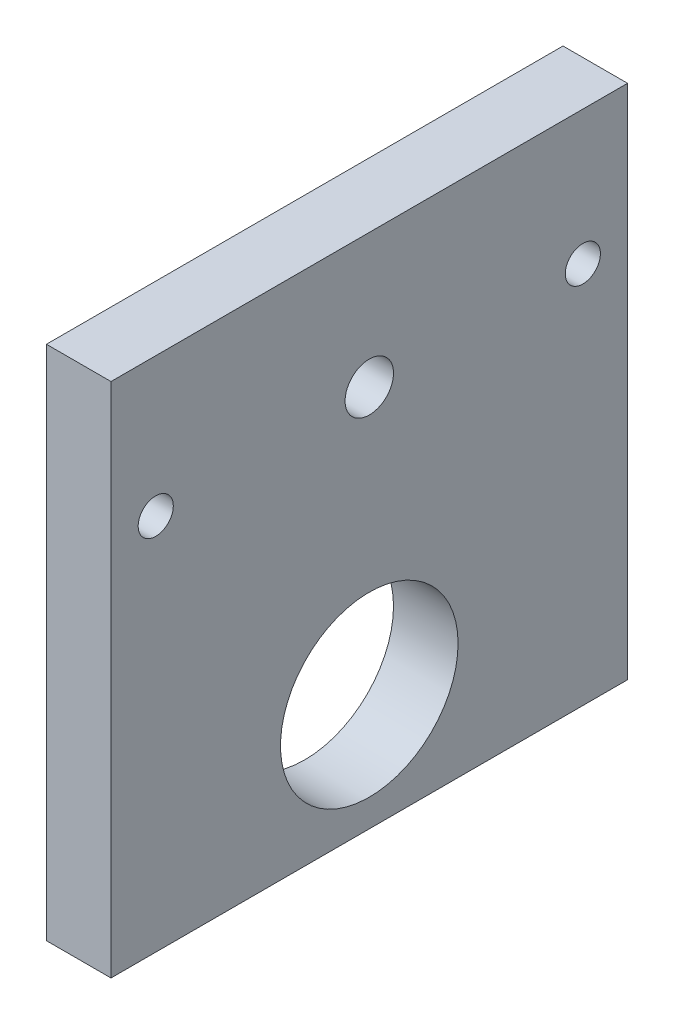
ISO-10303-21;
HEADER;
FILE_DESCRIPTION(('STEP AP214'),'2;1');
FILE_NAME('part.step','',(''),(''),'','','');
FILE_SCHEMA(('AUTOMOTIVE_DESIGN { 1 0 10303 214 1 1 1 1 }'));
ENDSEC;
DATA;
#1=APPLICATION_CONTEXT('core data for automotive mechanical design processes');
#2=APPLICATION_PROTOCOL_DEFINITION('international standard','automotive_design',2000,#1);
#3=PRODUCT_CONTEXT('',#1,'mechanical');
#4=PRODUCT('Part','Part','',(#3));
#5=PRODUCT_RELATED_PRODUCT_CATEGORY('part','',(#4));
#6=PRODUCT_DEFINITION_FORMATION('','',#4);
#7=PRODUCT_DEFINITION_CONTEXT('part definition',#1,'design');
#8=PRODUCT_DEFINITION('design','',#6,#7);
#9=PRODUCT_DEFINITION_SHAPE('','',#8);
#10=(LENGTH_UNIT() NAMED_UNIT(*) SI_UNIT(.MILLI.,.METRE.));
#11=(NAMED_UNIT(*) PLANE_ANGLE_UNIT() SI_UNIT($,.RADIAN.));
#12=(NAMED_UNIT(*) SI_UNIT($,.STERADIAN.) SOLID_ANGLE_UNIT());
#13=UNCERTAINTY_MEASURE_WITH_UNIT(LENGTH_MEASURE(1.E-05),#10,'distance_accuracy_value','');
#14=(GEOMETRIC_REPRESENTATION_CONTEXT(3) GLOBAL_UNCERTAINTY_ASSIGNED_CONTEXT((#13)) GLOBAL_UNIT_ASSIGNED_CONTEXT((#10,
#11,#12)) REPRESENTATION_CONTEXT('',''));
#15=CARTESIAN_POINT('',(0.,0.,0.));
#16=DIRECTION('',(0.,0.,1.));
#17=DIRECTION('',(1.,0.,0.));
#18=AXIS2_PLACEMENT_3D('',#15,#16,#17);
#19=CARTESIAN_POINT('',(6.35,-25.4,-25.4));
#20=DIRECTION('',(0.,0.,1.));
#21=DIRECTION('',(1.,0.,0.));
#22=AXIS2_PLACEMENT_3D('',#19,#20,#21);
#23=PLANE('',#22);
#24=DIRECTION('',(0.,1.,0.));
#25=VECTOR('',#24,1.);
#26=CARTESIAN_POINT('',(0.,-25.4,-25.4));
#27=LINE('',#26,#25);
#28=CARTESIAN_POINT('',(0.,-25.4,-25.4));
#29=VERTEX_POINT('',#28);
#30=CARTESIAN_POINT('',(0.,25.4,-25.4));
#31=VERTEX_POINT('',#30);
#32=EDGE_CURVE('E100',#29,#31,#27,.T.);
#33=ORIENTED_EDGE('',*,*,#32,.T.);
#34=DIRECTION('',(-1.,0.,0.));
#35=VECTOR('',#34,1.);
#36=CARTESIAN_POINT('',(6.35,25.4,-25.4));
#37=LINE('',#36,#35);
#38=CARTESIAN_POINT('',(6.35,25.4,-25.4));
#39=VERTEX_POINT('',#38);
#40=EDGE_CURVE('E11',#39,#31,#37,.T.);
#41=ORIENTED_EDGE('',*,*,#40,.F.);
#42=DIRECTION('',(0.,1.,0.));
#43=VECTOR('',#42,1.);
#44=CARTESIAN_POINT('',(6.35,-25.4,-25.4));
#45=LINE('',#44,#43);
#46=CARTESIAN_POINT('',(6.35,-25.4,-25.4));
#47=VERTEX_POINT('',#46);
#48=EDGE_CURVE('E87',#47,#39,#45,.T.);
#49=ORIENTED_EDGE('',*,*,#48,.F.);
#50=DIRECTION('',(-1.,0.,0.));
#51=VECTOR('',#50,1.);
#52=CARTESIAN_POINT('',(6.35,-25.4,-25.4));
#53=LINE('',#52,#51);
#54=EDGE_CURVE('E96',#47,#29,#53,.T.);
#55=ORIENTED_EDGE('',*,*,#54,.T.);
#56=EDGE_LOOP('',(#33,#41,#49,#55));
#57=FACE_BOUND('',#56,.T.);
#58=ADVANCED_FACE('F35',(#57),#23,.F.);
#59=CARTESIAN_POINT('',(6.35,25.4,25.4));
#60=DIRECTION('',(0.,-1.,0.));
#61=DIRECTION('',(0.,0.,-1.));
#62=AXIS2_PLACEMENT_3D('',#59,#60,#61);
#63=PLANE('',#62);
#64=DIRECTION('',(0.,0.,1.));
#65=VECTOR('',#64,1.);
#66=CARTESIAN_POINT('',(0.,25.4,25.4));
#67=LINE('',#66,#65);
#68=CARTESIAN_POINT('',(0.,25.4,25.4));
#69=VERTEX_POINT('',#68);
#70=EDGE_CURVE('E91',#31,#69,#67,.T.);
#71=ORIENTED_EDGE('',*,*,#70,.T.);
#72=DIRECTION('',(-1.,0.,0.));
#73=VECTOR('',#72,1.);
#74=CARTESIAN_POINT('',(6.35,25.4,25.4));
#75=LINE('',#74,#73);
#76=CARTESIAN_POINT('',(6.35,25.4,25.4));
#77=VERTEX_POINT('',#76);
#78=EDGE_CURVE('E44',#77,#69,#75,.T.);
#79=ORIENTED_EDGE('',*,*,#78,.F.);
#80=DIRECTION('',(0.,0.,1.));
#81=VECTOR('',#80,1.);
#82=CARTESIAN_POINT('',(6.35,25.4,25.4));
#83=LINE('',#82,#81);
#84=EDGE_CURVE('E82',#39,#77,#83,.T.);
#85=ORIENTED_EDGE('',*,*,#84,.F.);
#86=ORIENTED_EDGE('',*,*,#40,.T.);
#87=EDGE_LOOP('',(#71,#79,#85,#86));
#88=FACE_BOUND('',#87,.T.);
#89=ADVANCED_FACE('F90',(#88),#63,.F.);
#90=CARTESIAN_POINT('',(6.35,-25.4,25.4));
#91=DIRECTION('',(0.,0.,-1.));
#92=DIRECTION('',(-1.,0.,0.));
#93=AXIS2_PLACEMENT_3D('',#90,#91,#92);
#94=PLANE('',#93);
#95=DIRECTION('',(0.,-1.,0.));
#96=VECTOR('',#95,1.);
#97=CARTESIAN_POINT('',(0.,-25.4,25.4));
#98=LINE('',#97,#96);
#99=CARTESIAN_POINT('',(0.,-25.4,25.4));
#100=VERTEX_POINT('',#99);
#101=EDGE_CURVE('E69',#69,#100,#98,.T.);
#102=ORIENTED_EDGE('',*,*,#101,.T.);
#103=DIRECTION('',(-1.,0.,0.));
#104=VECTOR('',#103,1.);
#105=CARTESIAN_POINT('',(6.35,-25.4,25.4));
#106=LINE('',#105,#104);
#107=CARTESIAN_POINT('',(6.35,-25.4,25.4));
#108=VERTEX_POINT('',#107);
#109=EDGE_CURVE('E92',#108,#100,#106,.T.);
#110=ORIENTED_EDGE('',*,*,#109,.F.);
#111=DIRECTION('',(0.,-1.,0.));
#112=VECTOR('',#111,1.);
#113=CARTESIAN_POINT('',(6.35,-25.4,25.4));
#114=LINE('',#113,#112);
#115=EDGE_CURVE('E85',#77,#108,#114,.T.);
#116=ORIENTED_EDGE('',*,*,#115,.F.);
#117=ORIENTED_EDGE('',*,*,#78,.T.);
#118=EDGE_LOOP('',(#102,#110,#116,#117));
#119=FACE_BOUND('',#118,.T.);
#120=ADVANCED_FACE('F94',(#119),#94,.F.);
#121=CARTESIAN_POINT('',(6.35,-25.4,25.4));
#122=DIRECTION('',(0.,1.,0.));
#123=DIRECTION('',(0.,0.,1.));
#124=AXIS2_PLACEMENT_3D('',#121,#122,#123);
#125=PLANE('',#124);
#126=DIRECTION('',(0.,0.,-1.));
#127=VECTOR('',#126,1.);
#128=CARTESIAN_POINT('',(0.,-25.4,25.4));
#129=LINE('',#128,#127);
#130=EDGE_CURVE('E75',#100,#29,#129,.T.);
#131=ORIENTED_EDGE('',*,*,#130,.T.);
#132=ORIENTED_EDGE('',*,*,#54,.F.);
#133=DIRECTION('',(0.,0.,-1.));
#134=VECTOR('',#133,1.);
#135=CARTESIAN_POINT('',(6.35,-25.4,25.4));
#136=LINE('',#135,#134);
#137=EDGE_CURVE('E52',#108,#47,#136,.T.);
#138=ORIENTED_EDGE('',*,*,#137,.F.);
#139=ORIENTED_EDGE('',*,*,#109,.T.);
#140=EDGE_LOOP('',(#131,#132,#138,#139));
#141=FACE_BOUND('',#140,.T.);
#142=ADVANCED_FACE('F108',(#141),#125,.F.);
#143=CARTESIAN_POINT('',(6.35,0.,0.));
#144=DIRECTION('',(-1.,0.,0.));
#145=DIRECTION('',(0.,0.,1.));
#146=AXIS2_PLACEMENT_3D('',#143,#144,#145);
#147=PLANE('',#146);
#148=CARTESIAN_POINT('',(6.35,12.2301,-21.));
#149=DIRECTION('',(1.,0.,0.));
#150=DIRECTION('',(0.,0.,-1.));
#151=AXIS2_PLACEMENT_3D('',#148,#149,#150);
#152=CIRCLE('',#151,1.72719999999999);
#153=CARTESIAN_POINT('',(6.35,12.2301,-22.7272));
#154=VERTEX_POINT('',#153);
#155=EDGE_CURVE('E131',#154,#154,#152,.T.);
#156=ORIENTED_EDGE('',*,*,#155,.F.);
#157=EDGE_LOOP('',(#156));
#158=FACE_BOUND('',#157,.T.);
#159=CARTESIAN_POINT('',(6.35,11.7414591500542,21.));
#160=DIRECTION('',(1.,0.,0.));
#161=DIRECTION('',(0.,0.,-1.));
#162=AXIS2_PLACEMENT_3D('',#159,#160,#161);
#163=CIRCLE('',#162,1.72719999999999);
#164=CARTESIAN_POINT('',(6.35,11.7414591500542,19.2728));
#165=VERTEX_POINT('',#164);
#166=EDGE_CURVE('E125',#165,#165,#163,.T.);
#167=ORIENTED_EDGE('',*,*,#166,.F.);
#168=EDGE_LOOP('',(#167));
#169=FACE_BOUND('',#168,.T.);
#170=CARTESIAN_POINT('',(6.35,12.2301,0.));
#171=DIRECTION('',(1.,0.,0.));
#172=DIRECTION('',(0.,0.,-1.));
#173=AXIS2_PLACEMENT_3D('',#170,#171,#172);
#174=CIRCLE('',#173,2.38124999999999);
#175=CARTESIAN_POINT('',(6.35,12.2301,-2.38124999999999));
#176=VERTEX_POINT('',#175);
#177=EDGE_CURVE('E122',#176,#176,#174,.T.);
#178=ORIENTED_EDGE('',*,*,#177,.F.);
#179=EDGE_LOOP('',(#178));
#180=FACE_BOUND('',#179,.T.);
#181=CARTESIAN_POINT('',(6.35,-13.97,0.));
#182=DIRECTION('',(1.,0.,0.));
#183=DIRECTION('',(0.,0.,-1.));
#184=AXIS2_PLACEMENT_3D('',#181,#182,#183);
#185=CIRCLE('',#184,8.73124999999999);
#186=CARTESIAN_POINT('',(6.35,-13.97,-8.73124999999999));
#187=VERTEX_POINT('',#186);
#188=EDGE_CURVE('E116',#187,#187,#185,.T.);
#189=ORIENTED_EDGE('',*,*,#188,.F.);
#190=EDGE_LOOP('',(#189));
#191=FACE_BOUND('',#190,.T.);
#192=ORIENTED_EDGE('',*,*,#48,.T.);
#193=ORIENTED_EDGE('',*,*,#84,.T.);
#194=ORIENTED_EDGE('',*,*,#115,.T.);
#195=ORIENTED_EDGE('',*,*,#137,.T.);
#196=EDGE_LOOP('',(#192,#193,#194,#195));
#197=FACE_BOUND('',#196,.T.);
#198=ADVANCED_FACE('F83',(#158,#169,#180,#191,#197),#147,.F.);
#199=CARTESIAN_POINT('',(0.,0.,0.));
#200=DIRECTION('',(-1.,0.,0.));
#201=DIRECTION('',(0.,0.,1.));
#202=AXIS2_PLACEMENT_3D('',#199,#200,#201);
#203=PLANE('',#202);
#204=CARTESIAN_POINT('',(0.,12.2301,-21.));
#205=DIRECTION('',(-1.,0.,0.));
#206=DIRECTION('',(0.,0.,1.));
#207=AXIS2_PLACEMENT_3D('',#204,#205,#206);
#208=CIRCLE('',#207,1.72719999999999);
#209=CARTESIAN_POINT('',(0.,12.2301,-19.2728));
#210=VERTEX_POINT('',#209);
#211=EDGE_CURVE('E128',#210,#210,#208,.T.);
#212=ORIENTED_EDGE('',*,*,#211,.F.);
#213=EDGE_LOOP('',(#212));
#214=FACE_BOUND('',#213,.T.);
#215=CARTESIAN_POINT('',(0.,11.7414591500542,21.));
#216=DIRECTION('',(-1.,0.,0.));
#217=DIRECTION('',(0.,0.,1.));
#218=AXIS2_PLACEMENT_3D('',#215,#216,#217);
#219=CIRCLE('',#218,1.72719999999999);
#220=CARTESIAN_POINT('',(0.,11.7414591500542,22.7272));
#221=VERTEX_POINT('',#220);
#222=EDGE_CURVE('E38',#221,#221,#219,.T.);
#223=ORIENTED_EDGE('',*,*,#222,.F.);
#224=EDGE_LOOP('',(#223));
#225=FACE_BOUND('',#224,.T.);
#226=CARTESIAN_POINT('',(0.,12.2301,0.));
#227=DIRECTION('',(-1.,0.,0.));
#228=DIRECTION('',(0.,0.,1.));
#229=AXIS2_PLACEMENT_3D('',#226,#227,#228);
#230=CIRCLE('',#229,2.38124999999999);
#231=CARTESIAN_POINT('',(0.,12.2301,2.38124999999999));
#232=VERTEX_POINT('',#231);
#233=EDGE_CURVE('E119',#232,#232,#230,.T.);
#234=ORIENTED_EDGE('',*,*,#233,.F.);
#235=EDGE_LOOP('',(#234));
#236=FACE_BOUND('',#235,.T.);
#237=CARTESIAN_POINT('',(0.,-13.97,0.));
#238=DIRECTION('',(-1.,0.,0.));
#239=DIRECTION('',(0.,0.,1.));
#240=AXIS2_PLACEMENT_3D('',#237,#238,#239);
#241=CIRCLE('',#240,8.73124999999999);
#242=CARTESIAN_POINT('',(0.,-13.97,8.73124999999998));
#243=VERTEX_POINT('',#242);
#244=EDGE_CURVE('E103',#243,#243,#241,.T.);
#245=ORIENTED_EDGE('',*,*,#244,.F.);
#246=EDGE_LOOP('',(#245));
#247=FACE_BOUND('',#246,.T.);
#248=ORIENTED_EDGE('',*,*,#32,.F.);
#249=ORIENTED_EDGE('',*,*,#130,.F.);
#250=ORIENTED_EDGE('',*,*,#101,.F.);
#251=ORIENTED_EDGE('',*,*,#70,.F.);
#252=EDGE_LOOP('',(#248,#249,#250,#251));
#253=FACE_BOUND('',#252,.T.);
#254=ADVANCED_FACE('F111',(#214,#225,#236,#247,#253),#203,.T.);
#255=CARTESIAN_POINT('',(6.35,-13.97,0.));
#256=DIRECTION('',(1.,0.,0.));
#257=DIRECTION('',(0.,0.,-1.));
#258=AXIS2_PLACEMENT_3D('',#255,#256,#257);
#259=CYLINDRICAL_SURFACE('',#258,8.73124999999999);
#260=ORIENTED_EDGE('',*,*,#244,.T.);
#261=EDGE_LOOP('',(#260));
#262=FACE_BOUND('',#261,.T.);
#263=ORIENTED_EDGE('',*,*,#188,.T.);
#264=EDGE_LOOP('',(#263));
#265=FACE_BOUND('',#264,.T.);
#266=ADVANCED_FACE('F146',(#262,#265),#259,.F.);
#267=CARTESIAN_POINT('',(6.35,12.2301,0.));
#268=DIRECTION('',(1.,0.,0.));
#269=DIRECTION('',(0.,0.,-1.));
#270=AXIS2_PLACEMENT_3D('',#267,#268,#269);
#271=CYLINDRICAL_SURFACE('',#270,2.38124999999999);
#272=ORIENTED_EDGE('',*,*,#233,.T.);
#273=EDGE_LOOP('',(#272));
#274=FACE_BOUND('',#273,.T.);
#275=ORIENTED_EDGE('',*,*,#177,.T.);
#276=EDGE_LOOP('',(#275));
#277=FACE_BOUND('',#276,.T.);
#278=ADVANCED_FACE('F148',(#274,#277),#271,.F.);
#279=CARTESIAN_POINT('',(6.35,11.7414591500542,21.));
#280=DIRECTION('',(1.,0.,0.));
#281=DIRECTION('',(0.,0.,-1.));
#282=AXIS2_PLACEMENT_3D('',#279,#280,#281);
#283=CYLINDRICAL_SURFACE('',#282,1.72719999999999);
#284=ORIENTED_EDGE('',*,*,#222,.T.);
#285=EDGE_LOOP('',(#284));
#286=FACE_BOUND('',#285,.T.);
#287=ORIENTED_EDGE('',*,*,#166,.T.);
#288=EDGE_LOOP('',(#287));
#289=FACE_BOUND('',#288,.T.);
#290=ADVANCED_FACE('F155',(#286,#289),#283,.F.);
#291=CARTESIAN_POINT('',(6.35,12.2301,-21.));
#292=DIRECTION('',(1.,0.,0.));
#293=DIRECTION('',(0.,0.,-1.));
#294=AXIS2_PLACEMENT_3D('',#291,#292,#293);
#295=CYLINDRICAL_SURFACE('',#294,1.72719999999999);
#296=ORIENTED_EDGE('',*,*,#211,.T.);
#297=EDGE_LOOP('',(#296));
#298=FACE_BOUND('',#297,.T.);
#299=ORIENTED_EDGE('',*,*,#155,.T.);
#300=EDGE_LOOP('',(#299));
#301=FACE_BOUND('',#300,.T.);
#302=ADVANCED_FACE('F135',(#298,#301),#295,.F.);
#303=CLOSED_SHELL('',(#58,#89,#120,#142,#198,#254,#266,#278,#290,#302));
#304=MANIFOLD_SOLID_BREP('B2',#303);
#305=ADVANCED_BREP_SHAPE_REPRESENTATION('',(#18,#304),#14);
#306=SHAPE_DEFINITION_REPRESENTATION(#9,#305);
ENDSEC;
END-ISO-10303-21;
